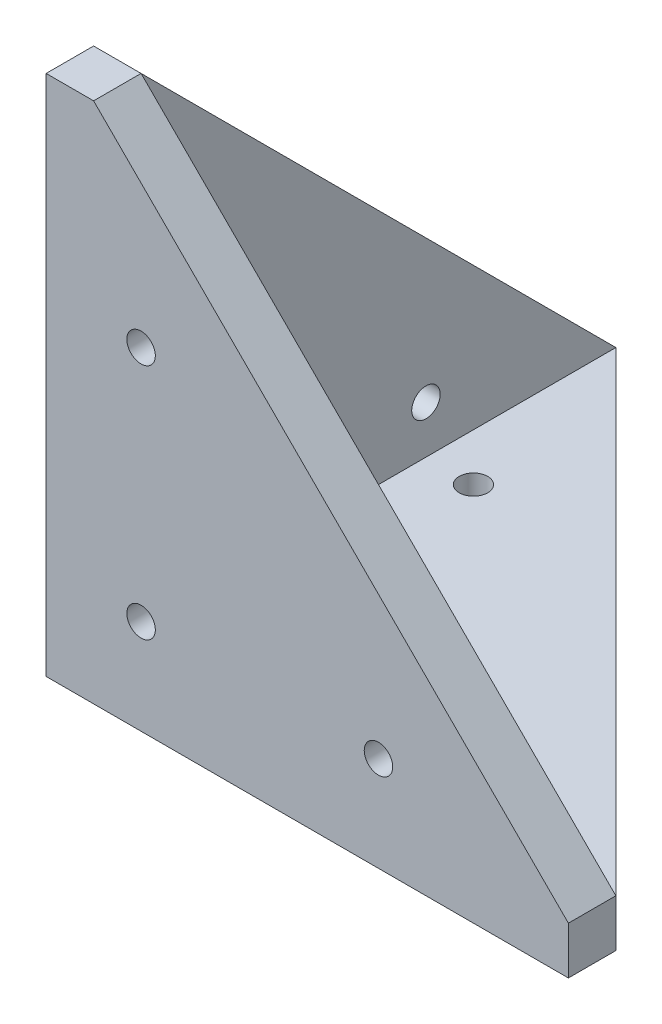
ISO-10303-21;
HEADER;
FILE_DESCRIPTION(('STEP AP214'),'2;1');
FILE_NAME('part.step','',(''),(''),'','','');
FILE_SCHEMA(('AUTOMOTIVE_DESIGN { 1 0 10303 214 1 1 1 1 }'));
ENDSEC;
DATA;
#1=APPLICATION_CONTEXT('core data for automotive mechanical design processes');
#2=APPLICATION_PROTOCOL_DEFINITION('international standard','automotive_design',2000,#1);
#3=PRODUCT_CONTEXT('',#1,'mechanical');
#4=PRODUCT('Part','Part','',(#3));
#5=PRODUCT_RELATED_PRODUCT_CATEGORY('part','',(#4));
#6=PRODUCT_DEFINITION_FORMATION('','',#4);
#7=PRODUCT_DEFINITION_CONTEXT('part definition',#1,'design');
#8=PRODUCT_DEFINITION('design','',#6,#7);
#9=PRODUCT_DEFINITION_SHAPE('','',#8);
#10=(LENGTH_UNIT() NAMED_UNIT(*) SI_UNIT(.MILLI.,.METRE.));
#11=(NAMED_UNIT(*) PLANE_ANGLE_UNIT() SI_UNIT($,.RADIAN.));
#12=(NAMED_UNIT(*) SI_UNIT($,.STERADIAN.) SOLID_ANGLE_UNIT());
#13=UNCERTAINTY_MEASURE_WITH_UNIT(LENGTH_MEASURE(1.E-05),#10,'distance_accuracy_value','');
#14=(GEOMETRIC_REPRESENTATION_CONTEXT(3) GLOBAL_UNCERTAINTY_ASSIGNED_CONTEXT((#13)) GLOBAL_UNIT_ASSIGNED_CONTEXT((#10,
#11,#12)) REPRESENTATION_CONTEXT('',''));
#15=CARTESIAN_POINT('',(0.,0.,0.));
#16=DIRECTION('',(0.,0.,1.));
#17=DIRECTION('',(1.,0.,0.));
#18=AXIS2_PLACEMENT_3D('',#15,#16,#17);
#19=CARTESIAN_POINT('',(0.,50.,5.));
#20=DIRECTION('',(0.,-1.,0.));
#21=DIRECTION('',(0.,0.,-1.));
#22=AXIS2_PLACEMENT_3D('',#19,#20,#21);
#23=PLANE('',#22);
#24=DIRECTION('',(-1.,0.,0.));
#25=VECTOR('',#24,1.);
#26=CARTESIAN_POINT('',(0.,50.,0.));
#27=LINE('',#26,#25);
#28=CARTESIAN_POINT('',(0.,50.,0.));
#29=VERTEX_POINT('',#28);
#30=CARTESIAN_POINT('',(-4.99999999999999,50.,0.));
#31=VERTEX_POINT('',#30);
#32=EDGE_CURVE('E115',#29,#31,#27,.T.);
#33=ORIENTED_EDGE('',*,*,#32,.T.);
#34=DIRECTION('',(0.,0.,-1.));
#35=VECTOR('',#34,1.);
#36=CARTESIAN_POINT('',(-4.99999999999999,50.,5.));
#37=LINE('',#36,#35);
#38=CARTESIAN_POINT('',(-4.99999999999999,50.,5.));
#39=VERTEX_POINT('',#38);
#40=EDGE_CURVE('E11',#39,#31,#37,.T.);
#41=ORIENTED_EDGE('',*,*,#40,.F.);
#42=DIRECTION('',(-1.,0.,0.));
#43=VECTOR('',#42,1.);
#44=CARTESIAN_POINT('',(0.,50.,5.));
#45=LINE('',#44,#43);
#46=CARTESIAN_POINT('',(0.,50.,5.));
#47=VERTEX_POINT('',#46);
#48=EDGE_CURVE('E123',#47,#39,#45,.T.);
#49=ORIENTED_EDGE('',*,*,#48,.F.);
#50=DIRECTION('',(0.,0.,-1.));
#51=VECTOR('',#50,1.);
#52=CARTESIAN_POINT('',(0.,50.,5.));
#53=LINE('',#52,#51);
#54=EDGE_CURVE('E111',#47,#29,#53,.T.);
#55=ORIENTED_EDGE('',*,*,#54,.T.);
#56=EDGE_LOOP('',(#33,#41,#49,#55));
#57=FACE_BOUND('',#56,.T.);
#58=ADVANCED_FACE('F33',(#57),#23,.F.);
#59=CARTESIAN_POINT('',(-4.99999999999999,50.,5.));
#60=DIRECTION('',(1.,0.,0.));
#61=DIRECTION('',(0.,1.,0.));
#62=AXIS2_PLACEMENT_3D('',#59,#60,#61);
#63=PLANE('',#62);
#64=CARTESIAN_POINT('',(-5.,30.,-5.));
#65=DIRECTION('',(1.,0.,0.));
#66=DIRECTION('',(0.,0.,-1.));
#67=AXIS2_PLACEMENT_3D('',#64,#65,#66);
#68=CIRCLE('',#67,1.5);
#69=CARTESIAN_POINT('',(-5.,30.,-6.5));
#70=VERTEX_POINT('',#69);
#71=EDGE_CURVE('E208',#70,#70,#68,.T.);
#72=ORIENTED_EDGE('',*,*,#71,.T.);
#73=EDGE_LOOP('',(#72));
#74=FACE_BOUND('',#73,.T.);
#75=CARTESIAN_POINT('',(-5.,5.,-30.));
#76=DIRECTION('',(1.,0.,0.));
#77=DIRECTION('',(0.,0.,-1.));
#78=AXIS2_PLACEMENT_3D('',#75,#76,#77);
#79=CIRCLE('',#78,1.5);
#80=CARTESIAN_POINT('',(-5.,5.,-31.5));
#81=VERTEX_POINT('',#80);
#82=EDGE_CURVE('E212',#81,#81,#79,.T.);
#83=ORIENTED_EDGE('',*,*,#82,.T.);
#84=EDGE_LOOP('',(#83));
#85=FACE_BOUND('',#84,.T.);
#86=CARTESIAN_POINT('',(-5.,5.,-5.));
#87=DIRECTION('',(1.,0.,0.));
#88=DIRECTION('',(0.,0.,-1.));
#89=AXIS2_PLACEMENT_3D('',#86,#87,#88);
#90=CIRCLE('',#89,1.4);
#91=CARTESIAN_POINT('',(-5.,5.,-6.40000000000001));
#92=VERTEX_POINT('',#91);
#93=EDGE_CURVE('E144',#92,#92,#90,.T.);
#94=ORIENTED_EDGE('',*,*,#93,.T.);
#95=EDGE_LOOP('',(#94));
#96=FACE_BOUND('',#95,.T.);
#97=ORIENTED_EDGE('',*,*,#40,.T.);
#98=DIRECTION('',(0.,0.707106781186547,0.707106781186547));
#99=VECTOR('',#98,1.);
#100=CARTESIAN_POINT('',(-5.,0.,-50.));
#101=LINE('',#100,#99);
#102=CARTESIAN_POINT('',(-5.,0.,-50.));
#103=VERTEX_POINT('',#102);
#104=EDGE_CURVE('E143',#103,#31,#101,.T.);
#105=ORIENTED_EDGE('',*,*,#104,.F.);
#106=DIRECTION('',(0.,-1.,0.));
#107=VECTOR('',#106,1.);
#108=CARTESIAN_POINT('',(-5.,0.,-50.));
#109=LINE('',#108,#107);
#110=CARTESIAN_POINT('',(-5.,-5.,-50.));
#111=VERTEX_POINT('',#110);
#112=EDGE_CURVE('E137',#103,#111,#109,.T.);
#113=ORIENTED_EDGE('',*,*,#112,.T.);
#114=DIRECTION('',(0.,0.,-1.));
#115=VECTOR('',#114,1.);
#116=CARTESIAN_POINT('',(-4.99999999999998,-5.,5.));
#117=LINE('',#116,#115);
#118=CARTESIAN_POINT('',(-4.99999999999998,-5.,5.));
#119=VERTEX_POINT('',#118);
#120=EDGE_CURVE('E41',#119,#111,#117,.T.);
#121=ORIENTED_EDGE('',*,*,#120,.F.);
#122=DIRECTION('',(0.,-1.,0.));
#123=VECTOR('',#122,1.);
#124=CARTESIAN_POINT('',(-4.99999999999999,50.,5.));
#125=LINE('',#124,#123);
#126=EDGE_CURVE('E93',#39,#119,#125,.T.);
#127=ORIENTED_EDGE('',*,*,#126,.F.);
#128=EDGE_LOOP('',(#97,#105,#113,#121,#127));
#129=FACE_BOUND('',#128,.T.);
#130=ADVANCED_FACE('F141',(#74,#85,#96,#129),#63,.F.);
#131=CARTESIAN_POINT('',(-4.99999999999998,-5.,5.));
#132=DIRECTION('',(0.,1.,0.));
#133=DIRECTION('',(0.,0.,1.));
#134=AXIS2_PLACEMENT_3D('',#131,#132,#133);
#135=PLANE('',#134);
#136=CARTESIAN_POINT('',(5.,-5.,-30.));
#137=DIRECTION('',(0.,1.,0.));
#138=DIRECTION('',(0.,0.,1.));
#139=AXIS2_PLACEMENT_3D('',#136,#137,#138);
#140=CIRCLE('',#139,1.5);
#141=CARTESIAN_POINT('',(5.,-5.,-28.5));
#142=VERTEX_POINT('',#141);
#143=EDGE_CURVE('E257',#142,#142,#140,.T.);
#144=ORIENTED_EDGE('',*,*,#143,.T.);
#145=EDGE_LOOP('',(#144));
#146=FACE_BOUND('',#145,.T.);
#147=CARTESIAN_POINT('',(5.,-5.,-5.));
#148=DIRECTION('',(0.,1.,0.));
#149=DIRECTION('',(0.,0.,1.));
#150=AXIS2_PLACEMENT_3D('',#147,#148,#149);
#151=CIRCLE('',#150,1.5);
#152=CARTESIAN_POINT('',(5.,-5.,-3.5));
#153=VERTEX_POINT('',#152);
#154=EDGE_CURVE('E265',#153,#153,#151,.T.);
#155=ORIENTED_EDGE('',*,*,#154,.T.);
#156=EDGE_LOOP('',(#155));
#157=FACE_BOUND('',#156,.T.);
#158=CARTESIAN_POINT('',(30.,-5.,-5.));
#159=DIRECTION('',(0.,1.,0.));
#160=DIRECTION('',(0.,0.,1.));
#161=AXIS2_PLACEMENT_3D('',#158,#159,#160);
#162=CIRCLE('',#161,1.50000000000001);
#163=CARTESIAN_POINT('',(30.,-5.,-3.49999999999999));
#164=VERTEX_POINT('',#163);
#165=EDGE_CURVE('E272',#164,#164,#162,.T.);
#166=ORIENTED_EDGE('',*,*,#165,.T.);
#167=EDGE_LOOP('',(#166));
#168=FACE_BOUND('',#167,.T.);
#169=ORIENTED_EDGE('',*,*,#120,.T.);
#170=DIRECTION('',(1.,0.,0.));
#171=VECTOR('',#170,1.);
#172=CARTESIAN_POINT('',(-5.,-5.,-50.));
#173=LINE('',#172,#171);
#174=CARTESIAN_POINT('',(0.,-5.,-50.));
#175=VERTEX_POINT('',#174);
#176=EDGE_CURVE('E128',#111,#175,#173,.T.);
#177=ORIENTED_EDGE('',*,*,#176,.T.);
#178=DIRECTION('',(0.707106781186547,0.,0.707106781186547));
#179=VECTOR('',#178,1.);
#180=CARTESIAN_POINT('',(0.,-5.,-50.));
#181=LINE('',#180,#179);
#182=CARTESIAN_POINT('',(50.,-5.,0.));
#183=VERTEX_POINT('',#182);
#184=EDGE_CURVE('E103',#175,#183,#181,.T.);
#185=ORIENTED_EDGE('',*,*,#184,.T.);
#186=DIRECTION('',(0.,0.,-1.));
#187=VECTOR('',#186,1.);
#188=CARTESIAN_POINT('',(50.,-5.,5.));
#189=LINE('',#188,#187);
#190=CARTESIAN_POINT('',(50.,-5.,5.));
#191=VERTEX_POINT('',#190);
#192=EDGE_CURVE('E100',#191,#183,#189,.T.);
#193=ORIENTED_EDGE('',*,*,#192,.F.);
#194=DIRECTION('',(1.,0.,0.));
#195=VECTOR('',#194,1.);
#196=CARTESIAN_POINT('',(-4.99999999999998,-5.,5.));
#197=LINE('',#196,#195);
#198=EDGE_CURVE('E87',#119,#191,#197,.T.);
#199=ORIENTED_EDGE('',*,*,#198,.F.);
#200=EDGE_LOOP('',(#169,#177,#185,#193,#199));
#201=FACE_BOUND('',#200,.T.);
#202=ADVANCED_FACE('F101',(#146,#157,#168,#201),#135,.F.);
#203=CARTESIAN_POINT('',(50.,-5.,5.));
#204=DIRECTION('',(-1.,0.,0.));
#205=DIRECTION('',(0.,0.,1.));
#206=AXIS2_PLACEMENT_3D('',#203,#204,#205);
#207=PLANE('',#206);
#208=DIRECTION('',(0.,1.,0.));
#209=VECTOR('',#208,1.);
#210=CARTESIAN_POINT('',(50.,-5.,0.));
#211=LINE('',#210,#209);
#212=CARTESIAN_POINT('',(50.,0.,0.));
#213=VERTEX_POINT('',#212);
#214=EDGE_CURVE('E117',#183,#213,#211,.T.);
#215=ORIENTED_EDGE('',*,*,#214,.T.);
#216=DIRECTION('',(0.,0.,-1.));
#217=VECTOR('',#216,1.);
#218=CARTESIAN_POINT('',(50.,0.,5.));
#219=LINE('',#218,#217);
#220=CARTESIAN_POINT('',(50.,0.,5.));
#221=VERTEX_POINT('',#220);
#222=EDGE_CURVE('E106',#221,#213,#219,.T.);
#223=ORIENTED_EDGE('',*,*,#222,.F.);
#224=DIRECTION('',(0.,1.,0.));
#225=VECTOR('',#224,1.);
#226=CARTESIAN_POINT('',(50.,-5.,5.));
#227=LINE('',#226,#225);
#228=EDGE_CURVE('E91',#191,#221,#227,.T.);
#229=ORIENTED_EDGE('',*,*,#228,.F.);
#230=ORIENTED_EDGE('',*,*,#192,.T.);
#231=EDGE_LOOP('',(#215,#223,#229,#230));
#232=FACE_BOUND('',#231,.T.);
#233=ADVANCED_FACE('F108',(#232),#207,.F.);
#234=CARTESIAN_POINT('',(0.,50.,5.));
#235=DIRECTION('',(-0.707106781186548,-0.707106781186548,0.));
#236=DIRECTION('',(0.707106781186548,-0.707106781186548,0.));
#237=AXIS2_PLACEMENT_3D('',#234,#235,#236);
#238=PLANE('',#237);
#239=DIRECTION('',(-0.707106781186547,0.707106781186547,0.));
#240=VECTOR('',#239,1.);
#241=CARTESIAN_POINT('',(0.,50.,0.));
#242=LINE('',#241,#240);
#243=EDGE_CURVE('E120',#213,#29,#242,.T.);
#244=ORIENTED_EDGE('',*,*,#243,.T.);
#245=ORIENTED_EDGE('',*,*,#54,.F.);
#246=DIRECTION('',(-0.707106781186547,0.707106781186547,0.));
#247=VECTOR('',#246,1.);
#248=CARTESIAN_POINT('',(0.,50.,5.));
#249=LINE('',#248,#247);
#250=EDGE_CURVE('E49',#221,#47,#249,.T.);
#251=ORIENTED_EDGE('',*,*,#250,.F.);
#252=ORIENTED_EDGE('',*,*,#222,.T.);
#253=EDGE_LOOP('',(#244,#245,#251,#252));
#254=FACE_BOUND('',#253,.T.);
#255=ADVANCED_FACE('F184',(#254),#238,.F.);
#256=CARTESIAN_POINT('',(0.,0.,5.));
#257=DIRECTION('',(0.,0.,1.));
#258=DIRECTION('',(1.,0.,0.));
#259=AXIS2_PLACEMENT_3D('',#256,#257,#258);
#260=PLANE('',#259);
#261=CARTESIAN_POINT('',(5.,30.,5.));
#262=DIRECTION('',(0.,0.,-1.));
#263=DIRECTION('',(-1.,0.,0.));
#264=AXIS2_PLACEMENT_3D('',#261,#262,#263);
#265=CIRCLE('',#264,1.5);
#266=CARTESIAN_POINT('',(3.5,30.,5.));
#267=VERTEX_POINT('',#266);
#268=EDGE_CURVE('E234',#267,#267,#265,.T.);
#269=ORIENTED_EDGE('',*,*,#268,.T.);
#270=EDGE_LOOP('',(#269));
#271=FACE_BOUND('',#270,.T.);
#272=CARTESIAN_POINT('',(5.,5.,5.));
#273=DIRECTION('',(0.,0.,-1.));
#274=DIRECTION('',(-1.,0.,0.));
#275=AXIS2_PLACEMENT_3D('',#272,#273,#274);
#276=CIRCLE('',#275,1.5);
#277=CARTESIAN_POINT('',(3.5,5.,5.));
#278=VERTEX_POINT('',#277);
#279=EDGE_CURVE('E242',#278,#278,#276,.T.);
#280=ORIENTED_EDGE('',*,*,#279,.T.);
#281=EDGE_LOOP('',(#280));
#282=FACE_BOUND('',#281,.T.);
#283=CARTESIAN_POINT('',(30.,5.,5.));
#284=DIRECTION('',(0.,0.,-1.));
#285=DIRECTION('',(-1.,0.,0.));
#286=AXIS2_PLACEMENT_3D('',#283,#284,#285);
#287=CIRCLE('',#286,1.5);
#288=CARTESIAN_POINT('',(28.5,5.,5.));
#289=VERTEX_POINT('',#288);
#290=EDGE_CURVE('E252',#289,#289,#287,.T.);
#291=ORIENTED_EDGE('',*,*,#290,.T.);
#292=EDGE_LOOP('',(#291));
#293=FACE_BOUND('',#292,.T.);
#294=ORIENTED_EDGE('',*,*,#48,.T.);
#295=ORIENTED_EDGE('',*,*,#126,.T.);
#296=ORIENTED_EDGE('',*,*,#198,.T.);
#297=ORIENTED_EDGE('',*,*,#228,.T.);
#298=ORIENTED_EDGE('',*,*,#250,.T.);
#299=EDGE_LOOP('',(#294,#295,#296,#297,#298));
#300=FACE_BOUND('',#299,.T.);
#301=ADVANCED_FACE('F89',(#271,#282,#293,#300),#260,.T.);
#302=CARTESIAN_POINT('',(0.,0.,0.));
#303=DIRECTION('',(0.,0.,1.));
#304=DIRECTION('',(1.,0.,0.));
#305=AXIS2_PLACEMENT_3D('',#302,#303,#304);
#306=PLANE('',#305);
#307=CARTESIAN_POINT('',(5.,30.,0.));
#308=DIRECTION('',(0.,0.,-1.));
#309=DIRECTION('',(-1.,0.,0.));
#310=AXIS2_PLACEMENT_3D('',#307,#308,#309);
#311=CIRCLE('',#310,1.5);
#312=CARTESIAN_POINT('',(3.5,30.,0.));
#313=VERTEX_POINT('',#312);
#314=EDGE_CURVE('E238',#313,#313,#311,.T.);
#315=ORIENTED_EDGE('',*,*,#314,.F.);
#316=EDGE_LOOP('',(#315));
#317=FACE_BOUND('',#316,.T.);
#318=CARTESIAN_POINT('',(5.,5.,0.));
#319=DIRECTION('',(0.,0.,-1.));
#320=DIRECTION('',(-1.,0.,0.));
#321=AXIS2_PLACEMENT_3D('',#318,#319,#320);
#322=CIRCLE('',#321,1.5);
#323=CARTESIAN_POINT('',(3.5,5.,0.));
#324=VERTEX_POINT('',#323);
#325=EDGE_CURVE('E250',#324,#324,#322,.T.);
#326=ORIENTED_EDGE('',*,*,#325,.F.);
#327=EDGE_LOOP('',(#326));
#328=FACE_BOUND('',#327,.T.);
#329=CARTESIAN_POINT('',(30.,5.,0.));
#330=DIRECTION('',(0.,0.,-1.));
#331=DIRECTION('',(-1.,0.,0.));
#332=AXIS2_PLACEMENT_3D('',#329,#330,#331);
#333=CIRCLE('',#332,1.5);
#334=CARTESIAN_POINT('',(28.5,5.,0.));
#335=VERTEX_POINT('',#334);
#336=EDGE_CURVE('E228',#335,#335,#333,.T.);
#337=ORIENTED_EDGE('',*,*,#336,.F.);
#338=EDGE_LOOP('',(#337));
#339=FACE_BOUND('',#338,.T.);
#340=DIRECTION('',(-1.,0.,0.));
#341=VECTOR('',#340,1.);
#342=CARTESIAN_POINT('',(50.,0.,0.));
#343=LINE('',#342,#341);
#344=CARTESIAN_POINT('',(0.,0.,0.));
#345=VERTEX_POINT('',#344);
#346=EDGE_CURVE('E162',#213,#345,#343,.T.);
#347=ORIENTED_EDGE('',*,*,#346,.T.);
#348=DIRECTION('',(0.,-1.,0.));
#349=VECTOR('',#348,1.);
#350=CARTESIAN_POINT('',(0.,50.,0.));
#351=LINE('',#350,#349);
#352=EDGE_CURVE('E139',#29,#345,#351,.T.);
#353=ORIENTED_EDGE('',*,*,#352,.F.);
#354=ORIENTED_EDGE('',*,*,#243,.F.);
#355=EDGE_LOOP('',(#347,#353,#354));
#356=FACE_BOUND('',#355,.T.);
#357=ADVANCED_FACE('F182',(#317,#328,#339,#356),#306,.F.);
#358=CARTESIAN_POINT('',(0.,0.,-50.));
#359=DIRECTION('',(0.707106781186548,0.,-0.707106781186548));
#360=DIRECTION('',(-0.707106781186548,0.,-0.707106781186548));
#361=AXIS2_PLACEMENT_3D('',#358,#359,#360);
#362=PLANE('',#361);
#363=ORIENTED_EDGE('',*,*,#184,.F.);
#364=DIRECTION('',(0.,-1.,0.));
#365=VECTOR('',#364,1.);
#366=CARTESIAN_POINT('',(0.,0.,-50.));
#367=LINE('',#366,#365);
#368=CARTESIAN_POINT('',(0.,0.,-50.));
#369=VERTEX_POINT('',#368);
#370=EDGE_CURVE('E118',#369,#175,#367,.T.);
#371=ORIENTED_EDGE('',*,*,#370,.F.);
#372=DIRECTION('',(0.707106781186547,0.,0.707106781186547));
#373=VECTOR('',#372,1.);
#374=CARTESIAN_POINT('',(0.,0.,-50.));
#375=LINE('',#374,#373);
#376=EDGE_CURVE('E159',#369,#213,#375,.T.);
#377=ORIENTED_EDGE('',*,*,#376,.T.);
#378=ORIENTED_EDGE('',*,*,#214,.F.);
#379=EDGE_LOOP('',(#363,#371,#377,#378));
#380=FACE_BOUND('',#379,.T.);
#381=ADVANCED_FACE('F177',(#380),#362,.T.);
#382=CARTESIAN_POINT('',(0.,0.,0.));
#383=DIRECTION('',(0.,-1.,0.));
#384=DIRECTION('',(0.,0.,-1.));
#385=AXIS2_PLACEMENT_3D('',#382,#383,#384);
#386=PLANE('',#385);
#387=CARTESIAN_POINT('',(5.,0.,-30.));
#388=DIRECTION('',(0.,1.,0.));
#389=DIRECTION('',(0.,0.,1.));
#390=AXIS2_PLACEMENT_3D('',#387,#388,#389);
#391=CIRCLE('',#390,1.5);
#392=CARTESIAN_POINT('',(5.,0.,-28.5));
#393=VERTEX_POINT('',#392);
#394=EDGE_CURVE('E261',#393,#393,#391,.T.);
#395=ORIENTED_EDGE('',*,*,#394,.F.);
#396=EDGE_LOOP('',(#395));
#397=FACE_BOUND('',#396,.T.);
#398=CARTESIAN_POINT('',(5.,0.,-5.));
#399=DIRECTION('',(0.,1.,0.));
#400=DIRECTION('',(0.,0.,1.));
#401=AXIS2_PLACEMENT_3D('',#398,#399,#400);
#402=CIRCLE('',#401,1.5);
#403=CARTESIAN_POINT('',(5.,0.,-3.5));
#404=VERTEX_POINT('',#403);
#405=EDGE_CURVE('E270',#404,#404,#402,.T.);
#406=ORIENTED_EDGE('',*,*,#405,.F.);
#407=EDGE_LOOP('',(#406));
#408=FACE_BOUND('',#407,.T.);
#409=CARTESIAN_POINT('',(30.,0.,-5.));
#410=DIRECTION('',(0.,1.,0.));
#411=DIRECTION('',(0.,0.,1.));
#412=AXIS2_PLACEMENT_3D('',#409,#410,#411);
#413=CIRCLE('',#412,1.50000000000001);
#414=CARTESIAN_POINT('',(30.,0.,-3.49999999999999));
#415=VERTEX_POINT('',#414);
#416=EDGE_CURVE('E245',#415,#415,#413,.T.);
#417=ORIENTED_EDGE('',*,*,#416,.F.);
#418=EDGE_LOOP('',(#417));
#419=FACE_BOUND('',#418,.T.);
#420=ORIENTED_EDGE('',*,*,#376,.F.);
#421=DIRECTION('',(0.,0.,-1.));
#422=VECTOR('',#421,1.);
#423=CARTESIAN_POINT('',(0.,0.,0.));
#424=LINE('',#423,#422);
#425=EDGE_CURVE('E70',#345,#369,#424,.T.);
#426=ORIENTED_EDGE('',*,*,#425,.F.);
#427=ORIENTED_EDGE('',*,*,#346,.F.);
#428=EDGE_LOOP('',(#420,#426,#427));
#429=FACE_BOUND('',#428,.T.);
#430=ADVANCED_FACE('F175',(#397,#408,#419,#429),#386,.F.);
#431=CARTESIAN_POINT('',(0.,0.,0.));
#432=DIRECTION('',(1.,0.,0.));
#433=DIRECTION('',(0.,0.,-1.));
#434=AXIS2_PLACEMENT_3D('',#431,#432,#433);
#435=PLANE('',#434);
#436=CARTESIAN_POINT('',(0.,30.,-5.));
#437=DIRECTION('',(1.,0.,0.));
#438=DIRECTION('',(0.,0.,-1.));
#439=AXIS2_PLACEMENT_3D('',#436,#437,#438);
#440=CIRCLE('',#439,1.5);
#441=CARTESIAN_POINT('',(0.,30.,-6.5));
#442=VERTEX_POINT('',#441);
#443=EDGE_CURVE('E232',#442,#442,#440,.T.);
#444=ORIENTED_EDGE('',*,*,#443,.F.);
#445=EDGE_LOOP('',(#444));
#446=FACE_BOUND('',#445,.T.);
#447=CARTESIAN_POINT('',(0.,5.,-30.));
#448=DIRECTION('',(1.,0.,0.));
#449=DIRECTION('',(0.,0.,-1.));
#450=AXIS2_PLACEMENT_3D('',#447,#448,#449);
#451=CIRCLE('',#450,1.5);
#452=CARTESIAN_POINT('',(0.,5.,-31.5));
#453=VERTEX_POINT('',#452);
#454=EDGE_CURVE('E223',#453,#453,#451,.T.);
#455=ORIENTED_EDGE('',*,*,#454,.F.);
#456=EDGE_LOOP('',(#455));
#457=FACE_BOUND('',#456,.T.);
#458=CARTESIAN_POINT('',(0.,5.,-5.));
#459=DIRECTION('',(1.,0.,0.));
#460=DIRECTION('',(0.,0.,-1.));
#461=AXIS2_PLACEMENT_3D('',#458,#459,#460);
#462=CIRCLE('',#461,1.4);
#463=CARTESIAN_POINT('',(0.,5.,-6.40000000000001));
#464=VERTEX_POINT('',#463);
#465=EDGE_CURVE('E147',#464,#464,#462,.T.);
#466=ORIENTED_EDGE('',*,*,#465,.F.);
#467=EDGE_LOOP('',(#466));
#468=FACE_BOUND('',#467,.T.);
#469=ORIENTED_EDGE('',*,*,#425,.T.);
#470=DIRECTION('',(0.,0.707106781186547,0.707106781186547));
#471=VECTOR('',#470,1.);
#472=CARTESIAN_POINT('',(0.,0.,-50.));
#473=LINE('',#472,#471);
#474=EDGE_CURVE('E153',#369,#29,#473,.T.);
#475=ORIENTED_EDGE('',*,*,#474,.T.);
#476=ORIENTED_EDGE('',*,*,#352,.T.);
#477=EDGE_LOOP('',(#469,#475,#476));
#478=FACE_BOUND('',#477,.T.);
#479=ADVANCED_FACE('F179',(#446,#457,#468,#478),#435,.T.);
#480=CARTESIAN_POINT('',(-5.,0.,-50.));
#481=DIRECTION('',(0.,0.707106781186548,-0.707106781186548));
#482=DIRECTION('',(0.,0.707106781186548,0.707106781186548));
#483=AXIS2_PLACEMENT_3D('',#480,#481,#482);
#484=PLANE('',#483);
#485=ORIENTED_EDGE('',*,*,#474,.F.);
#486=DIRECTION('',(1.,0.,0.));
#487=VECTOR('',#486,1.);
#488=CARTESIAN_POINT('',(-5.,0.,-50.));
#489=LINE('',#488,#487);
#490=EDGE_CURVE('E152',#103,#369,#489,.T.);
#491=ORIENTED_EDGE('',*,*,#490,.F.);
#492=ORIENTED_EDGE('',*,*,#104,.T.);
#493=ORIENTED_EDGE('',*,*,#32,.F.);
#494=EDGE_LOOP('',(#485,#491,#492,#493));
#495=FACE_BOUND('',#494,.T.);
#496=ADVANCED_FACE('F173',(#495),#484,.T.);
#497=CARTESIAN_POINT('',(0.,0.,-50.));
#498=DIRECTION('',(0.,0.,1.));
#499=DIRECTION('',(1.,0.,0.));
#500=AXIS2_PLACEMENT_3D('',#497,#498,#499);
#501=PLANE('',#500);
#502=ORIENTED_EDGE('',*,*,#112,.F.);
#503=ORIENTED_EDGE('',*,*,#490,.T.);
#504=ORIENTED_EDGE('',*,*,#370,.T.);
#505=ORIENTED_EDGE('',*,*,#176,.F.);
#506=EDGE_LOOP('',(#502,#503,#504,#505));
#507=FACE_BOUND('',#506,.T.);
#508=ADVANCED_FACE('F135',(#507),#501,.F.);
#509=CARTESIAN_POINT('',(-5.,5.,-5.));
#510=DIRECTION('',(1.,0.,0.));
#511=DIRECTION('',(0.,0.,-1.));
#512=AXIS2_PLACEMENT_3D('',#509,#510,#511);
#513=CYLINDRICAL_SURFACE('',#512,1.4);
#514=ORIENTED_EDGE('',*,*,#93,.F.);
#515=EDGE_LOOP('',(#514));
#516=FACE_BOUND('',#515,.T.);
#517=ORIENTED_EDGE('',*,*,#465,.T.);
#518=EDGE_LOOP('',(#517));
#519=FACE_BOUND('',#518,.T.);
#520=ADVANCED_FACE('F215',(#516,#519),#513,.F.);
#521=CARTESIAN_POINT('',(-5.,5.,-30.));
#522=DIRECTION('',(1.,0.,0.));
#523=DIRECTION('',(0.,0.,-1.));
#524=AXIS2_PLACEMENT_3D('',#521,#522,#523);
#525=CYLINDRICAL_SURFACE('',#524,1.5);
#526=ORIENTED_EDGE('',*,*,#82,.F.);
#527=EDGE_LOOP('',(#526));
#528=FACE_BOUND('',#527,.T.);
#529=ORIENTED_EDGE('',*,*,#454,.T.);
#530=EDGE_LOOP('',(#529));
#531=FACE_BOUND('',#530,.T.);
#532=ADVANCED_FACE('F218',(#528,#531),#525,.F.);
#533=CARTESIAN_POINT('',(-5.,30.,-5.));
#534=DIRECTION('',(1.,0.,0.));
#535=DIRECTION('',(0.,0.,-1.));
#536=AXIS2_PLACEMENT_3D('',#533,#534,#535);
#537=CYLINDRICAL_SURFACE('',#536,1.5);
#538=ORIENTED_EDGE('',*,*,#71,.F.);
#539=EDGE_LOOP('',(#538));
#540=FACE_BOUND('',#539,.T.);
#541=ORIENTED_EDGE('',*,*,#443,.T.);
#542=EDGE_LOOP('',(#541));
#543=FACE_BOUND('',#542,.T.);
#544=ADVANCED_FACE('F315',(#540,#543),#537,.F.);
#545=CARTESIAN_POINT('',(30.,5.,5.));
#546=DIRECTION('',(0.,0.,-1.));
#547=DIRECTION('',(-1.,0.,0.));
#548=AXIS2_PLACEMENT_3D('',#545,#546,#547);
#549=CYLINDRICAL_SURFACE('',#548,1.5);
#550=ORIENTED_EDGE('',*,*,#290,.F.);
#551=EDGE_LOOP('',(#550));
#552=FACE_BOUND('',#551,.T.);
#553=ORIENTED_EDGE('',*,*,#336,.T.);
#554=EDGE_LOOP('',(#553));
#555=FACE_BOUND('',#554,.T.);
#556=ADVANCED_FACE('F306',(#552,#555),#549,.F.);
#557=CARTESIAN_POINT('',(5.,5.,5.));
#558=DIRECTION('',(0.,0.,-1.));
#559=DIRECTION('',(-1.,0.,0.));
#560=AXIS2_PLACEMENT_3D('',#557,#558,#559);
#561=CYLINDRICAL_SURFACE('',#560,1.5);
#562=ORIENTED_EDGE('',*,*,#279,.F.);
#563=EDGE_LOOP('',(#562));
#564=FACE_BOUND('',#563,.T.);
#565=ORIENTED_EDGE('',*,*,#325,.T.);
#566=EDGE_LOOP('',(#565));
#567=FACE_BOUND('',#566,.T.);
#568=ADVANCED_FACE('F303',(#564,#567),#561,.F.);
#569=CARTESIAN_POINT('',(5.,30.,5.));
#570=DIRECTION('',(0.,0.,-1.));
#571=DIRECTION('',(-1.,0.,0.));
#572=AXIS2_PLACEMENT_3D('',#569,#570,#571);
#573=CYLINDRICAL_SURFACE('',#572,1.5);
#574=ORIENTED_EDGE('',*,*,#268,.F.);
#575=EDGE_LOOP('',(#574));
#576=FACE_BOUND('',#575,.T.);
#577=ORIENTED_EDGE('',*,*,#314,.T.);
#578=EDGE_LOOP('',(#577));
#579=FACE_BOUND('',#578,.T.);
#580=ADVANCED_FACE('F305',(#576,#579),#573,.F.);
#581=CARTESIAN_POINT('',(30.,-5.,-5.));
#582=DIRECTION('',(0.,1.,0.));
#583=DIRECTION('',(0.,0.,1.));
#584=AXIS2_PLACEMENT_3D('',#581,#582,#583);
#585=CYLINDRICAL_SURFACE('',#584,1.50000000000001);
#586=ORIENTED_EDGE('',*,*,#165,.F.);
#587=EDGE_LOOP('',(#586));
#588=FACE_BOUND('',#587,.T.);
#589=ORIENTED_EDGE('',*,*,#416,.T.);
#590=EDGE_LOOP('',(#589));
#591=FACE_BOUND('',#590,.T.);
#592=ADVANCED_FACE('F279',(#588,#591),#585,.F.);
#593=CARTESIAN_POINT('',(5.,-5.,-5.));
#594=DIRECTION('',(0.,1.,0.));
#595=DIRECTION('',(0.,0.,1.));
#596=AXIS2_PLACEMENT_3D('',#593,#594,#595);
#597=CYLINDRICAL_SURFACE('',#596,1.5);
#598=ORIENTED_EDGE('',*,*,#154,.F.);
#599=EDGE_LOOP('',(#598));
#600=FACE_BOUND('',#599,.T.);
#601=ORIENTED_EDGE('',*,*,#405,.T.);
#602=EDGE_LOOP('',(#601));
#603=FACE_BOUND('',#602,.T.);
#604=ADVANCED_FACE('F407',(#600,#603),#597,.F.);
#605=CARTESIAN_POINT('',(5.,-5.,-30.));
#606=DIRECTION('',(0.,1.,0.));
#607=DIRECTION('',(0.,0.,1.));
#608=AXIS2_PLACEMENT_3D('',#605,#606,#607);
#609=CYLINDRICAL_SURFACE('',#608,1.5);
#610=ORIENTED_EDGE('',*,*,#143,.F.);
#611=EDGE_LOOP('',(#610));
#612=FACE_BOUND('',#611,.T.);
#613=ORIENTED_EDGE('',*,*,#394,.T.);
#614=EDGE_LOOP('',(#613));
#615=FACE_BOUND('',#614,.T.);
#616=ADVANCED_FACE('F416',(#612,#615),#609,.F.);
#617=CLOSED_SHELL('',(#58,#130,#202,#233,#255,#301,#357,#381,#430,#479,#496,#508,#520,#532,#544,
#556,#568,#580,#592,#604,#616));
#618=MANIFOLD_SOLID_BREP('B2',#617);
#619=ADVANCED_BREP_SHAPE_REPRESENTATION('',(#18,#618),#14);
#620=SHAPE_DEFINITION_REPRESENTATION(#9,#619);
ENDSEC;
END-ISO-10303-21;
